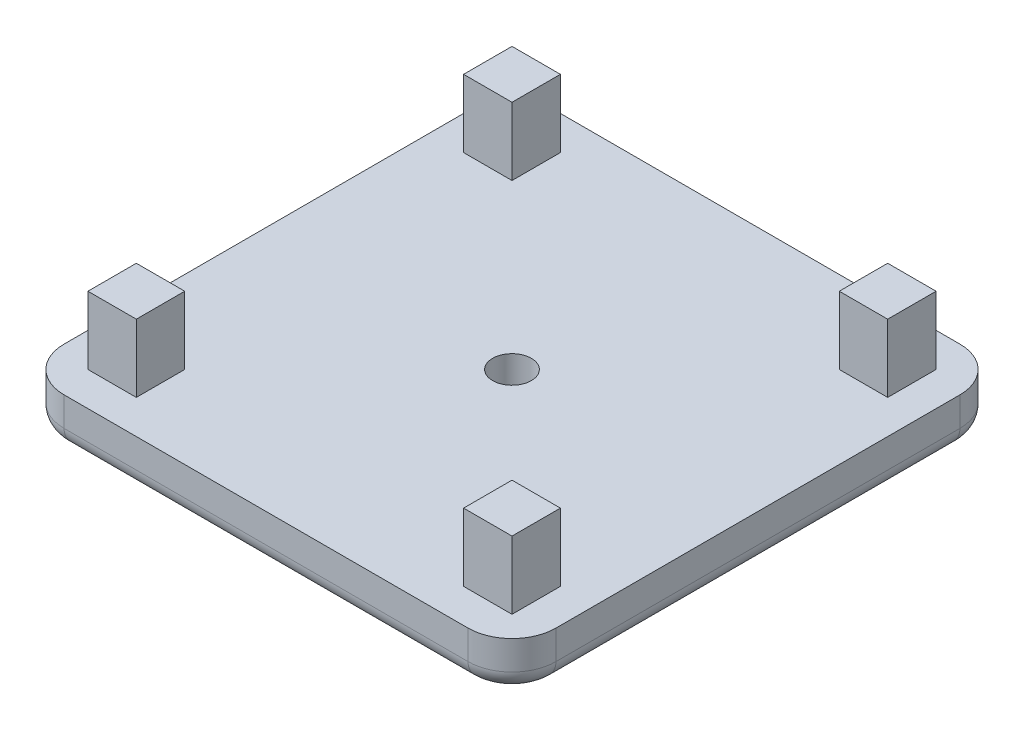
ISO-10303-21;
HEADER;
FILE_DESCRIPTION(('STEP AP214'),'2;1');
FILE_NAME('part.step','',(''),(''),'','','');
FILE_SCHEMA(('AUTOMOTIVE_DESIGN { 1 0 10303 214 1 1 1 1 }'));
ENDSEC;
DATA;
#1=APPLICATION_CONTEXT('core data for automotive mechanical design processes');
#2=APPLICATION_PROTOCOL_DEFINITION('international standard','automotive_design',2000,#1);
#3=PRODUCT_CONTEXT('',#1,'mechanical');
#4=PRODUCT('Part','Part','',(#3));
#5=PRODUCT_RELATED_PRODUCT_CATEGORY('part','',(#4));
#6=PRODUCT_DEFINITION_FORMATION('','',#4);
#7=PRODUCT_DEFINITION_CONTEXT('part definition',#1,'design');
#8=PRODUCT_DEFINITION('design','',#6,#7);
#9=PRODUCT_DEFINITION_SHAPE('','',#8);
#10=(LENGTH_UNIT() NAMED_UNIT(*) SI_UNIT(.MILLI.,.METRE.));
#11=(NAMED_UNIT(*) PLANE_ANGLE_UNIT() SI_UNIT($,.RADIAN.));
#12=(NAMED_UNIT(*) SI_UNIT($,.STERADIAN.) SOLID_ANGLE_UNIT());
#13=UNCERTAINTY_MEASURE_WITH_UNIT(LENGTH_MEASURE(1.E-05),#10,'distance_accuracy_value','');
#14=(GEOMETRIC_REPRESENTATION_CONTEXT(3) GLOBAL_UNCERTAINTY_ASSIGNED_CONTEXT((#13)) GLOBAL_UNIT_ASSIGNED_CONTEXT((#10,
#11,#12)) REPRESENTATION_CONTEXT('',''));
#15=CARTESIAN_POINT('',(0.,0.,0.));
#16=DIRECTION('',(0.,0.,1.));
#17=DIRECTION('',(1.,0.,0.));
#18=AXIS2_PLACEMENT_3D('',#15,#16,#17);
#19=CARTESIAN_POINT('',(0.,0.,0.));
#20=DIRECTION('',(0.,1.,0.));
#21=DIRECTION('',(0.,0.,1.));
#22=AXIS2_PLACEMENT_3D('',#19,#20,#21);
#23=PLANE('',#22);
#24=CARTESIAN_POINT('',(0.,0.,0.));
#25=DIRECTION('',(0.,1.,0.));
#26=DIRECTION('',(0.,0.,1.));
#27=AXIS2_PLACEMENT_3D('',#24,#25,#26);
#28=CIRCLE('',#27,2.);
#29=CARTESIAN_POINT('',(0.,0.,2.));
#30=VERTEX_POINT('',#29);
#31=EDGE_CURVE('E364',#30,#30,#28,.T.);
#32=ORIENTED_EDGE('',*,*,#31,.T.);
#33=EDGE_LOOP('',(#32));
#34=FACE_BOUND('',#33,.T.);
#35=CARTESIAN_POINT('',(20.86,0.,-20.86));
#36=DIRECTION('',(0.,1.,0.));
#37=DIRECTION('',(0.,0.,1.));
#38=AXIS2_PLACEMENT_3D('',#35,#36,#37);
#39=CIRCLE('',#38,2.54);
#40=CARTESIAN_POINT('',(23.4,0.,-20.86));
#41=VERTEX_POINT('',#40);
#42=CARTESIAN_POINT('',(20.86,0.,-23.4));
#43=VERTEX_POINT('',#42);
#44=EDGE_CURVE('E410',#41,#43,#39,.T.);
#45=ORIENTED_EDGE('',*,*,#44,.F.);
#46=DIRECTION('',(0.,0.,-1.));
#47=VECTOR('',#46,1.);
#48=CARTESIAN_POINT('',(23.4,0.,0.));
#49=LINE('',#48,#47);
#50=CARTESIAN_POINT('',(23.4,0.,20.86));
#51=VERTEX_POINT('',#50);
#52=EDGE_CURVE('E383',#41,#51,#49,.F.);
#53=ORIENTED_EDGE('',*,*,#52,.T.);
#54=CARTESIAN_POINT('',(20.86,0.,20.86));
#55=DIRECTION('',(0.,1.,0.));
#56=DIRECTION('',(0.,0.,1.));
#57=AXIS2_PLACEMENT_3D('',#54,#55,#56);
#58=CIRCLE('',#57,2.54);
#59=CARTESIAN_POINT('',(20.86,0.,23.4));
#60=VERTEX_POINT('',#59);
#61=EDGE_CURVE('E408',#60,#51,#58,.T.);
#62=ORIENTED_EDGE('',*,*,#61,.F.);
#63=DIRECTION('',(1.,0.,0.));
#64=VECTOR('',#63,1.);
#65=CARTESIAN_POINT('',(0.,0.,23.4));
#66=LINE('',#65,#64);
#67=CARTESIAN_POINT('',(-20.86,0.,23.4));
#68=VERTEX_POINT('',#67);
#69=EDGE_CURVE('E386',#60,#68,#66,.F.);
#70=ORIENTED_EDGE('',*,*,#69,.T.);
#71=CARTESIAN_POINT('',(-20.86,0.,20.86));
#72=DIRECTION('',(0.,1.,0.));
#73=DIRECTION('',(0.,0.,1.));
#74=AXIS2_PLACEMENT_3D('',#71,#72,#73);
#75=CIRCLE('',#74,2.54);
#76=CARTESIAN_POINT('',(-23.4,0.,20.86));
#77=VERTEX_POINT('',#76);
#78=EDGE_CURVE('E403',#77,#68,#75,.T.);
#79=ORIENTED_EDGE('',*,*,#78,.F.);
#80=DIRECTION('',(0.,0.,1.));
#81=VECTOR('',#80,1.);
#82=CARTESIAN_POINT('',(-23.4,0.,0.));
#83=LINE('',#82,#81);
#84=CARTESIAN_POINT('',(-23.4,0.,-20.86));
#85=VERTEX_POINT('',#84);
#86=EDGE_CURVE('E392',#77,#85,#83,.F.);
#87=ORIENTED_EDGE('',*,*,#86,.T.);
#88=CARTESIAN_POINT('',(-20.86,0.,-20.86));
#89=DIRECTION('',(0.,1.,0.));
#90=DIRECTION('',(0.,0.,1.));
#91=AXIS2_PLACEMENT_3D('',#88,#89,#90);
#92=CIRCLE('',#91,2.54);
#93=CARTESIAN_POINT('',(-20.86,0.,-23.4));
#94=VERTEX_POINT('',#93);
#95=EDGE_CURVE('E405',#94,#85,#92,.T.);
#96=ORIENTED_EDGE('',*,*,#95,.F.);
#97=DIRECTION('',(-1.,0.,0.));
#98=VECTOR('',#97,1.);
#99=CARTESIAN_POINT('',(0.,0.,-23.4));
#100=LINE('',#99,#98);
#101=EDGE_CURVE('E389',#94,#43,#100,.F.);
#102=ORIENTED_EDGE('',*,*,#101,.T.);
#103=EDGE_LOOP('',(#45,#53,#62,#70,#79,#87,#96,#102));
#104=FACE_BOUND('',#103,.T.);
#105=ADVANCED_FACE('F35',(#34,#104),#23,.F.);
#106=CARTESIAN_POINT('',(0.,5.,0.));
#107=DIRECTION('',(0.,1.,0.));
#108=DIRECTION('',(0.,0.,1.));
#109=AXIS2_PLACEMENT_3D('',#106,#107,#108);
#110=PLANE('',#109);
#111=DIRECTION('',(0.,0.,1.));
#112=VECTOR('',#111,1.);
#113=CARTESIAN_POINT('',(-25.4,5.,-25.4));
#114=LINE('',#113,#112);
#115=CARTESIAN_POINT('',(-25.4,5.,-20.86));
#116=VERTEX_POINT('',#115);
#117=CARTESIAN_POINT('',(-25.4,5.,20.86));
#118=VERTEX_POINT('',#117);
#119=EDGE_CURVE('E374',#116,#118,#114,.T.);
#120=ORIENTED_EDGE('',*,*,#119,.T.);
#121=CARTESIAN_POINT('',(-20.86,5.,20.86));
#122=DIRECTION('',(0.,1.,0.));
#123=DIRECTION('',(0.,0.,1.));
#124=AXIS2_PLACEMENT_3D('',#121,#122,#123);
#125=CIRCLE('',#124,4.54);
#126=CARTESIAN_POINT('',(-20.86,5.,25.4));
#127=VERTEX_POINT('',#126);
#128=EDGE_CURVE('E444',#118,#127,#125,.T.);
#129=ORIENTED_EDGE('',*,*,#128,.T.);
#130=DIRECTION('',(1.,0.,0.));
#131=VECTOR('',#130,1.);
#132=CARTESIAN_POINT('',(-25.4,5.,25.4));
#133=LINE('',#132,#131);
#134=CARTESIAN_POINT('',(20.86,5.,25.4));
#135=VERTEX_POINT('',#134);
#136=EDGE_CURVE('E377',#127,#135,#133,.T.);
#137=ORIENTED_EDGE('',*,*,#136,.T.);
#138=CARTESIAN_POINT('',(20.86,5.,20.86));
#139=DIRECTION('',(0.,1.,0.));
#140=DIRECTION('',(0.,0.,1.));
#141=AXIS2_PLACEMENT_3D('',#138,#139,#140);
#142=CIRCLE('',#141,4.54);
#143=CARTESIAN_POINT('',(25.4,5.,20.86));
#144=VERTEX_POINT('',#143);
#145=EDGE_CURVE('E440',#135,#144,#142,.T.);
#146=ORIENTED_EDGE('',*,*,#145,.T.);
#147=DIRECTION('',(0.,0.,-1.));
#148=VECTOR('',#147,1.);
#149=CARTESIAN_POINT('',(25.4,5.,-25.4));
#150=LINE('',#149,#148);
#151=CARTESIAN_POINT('',(25.4,5.,-20.86));
#152=VERTEX_POINT('',#151);
#153=EDGE_CURVE('E368',#144,#152,#150,.T.);
#154=ORIENTED_EDGE('',*,*,#153,.T.);
#155=CARTESIAN_POINT('',(20.86,5.,-20.86));
#156=DIRECTION('',(0.,1.,0.));
#157=DIRECTION('',(0.,0.,1.));
#158=AXIS2_PLACEMENT_3D('',#155,#156,#157);
#159=CIRCLE('',#158,4.54);
#160=CARTESIAN_POINT('',(20.86,5.,-25.4));
#161=VERTEX_POINT('',#160);
#162=EDGE_CURVE('E59',#152,#161,#159,.T.);
#163=ORIENTED_EDGE('',*,*,#162,.T.);
#164=DIRECTION('',(-1.,0.,0.));
#165=VECTOR('',#164,1.);
#166=CARTESIAN_POINT('',(-25.4,5.,-25.4));
#167=LINE('',#166,#165);
#168=CARTESIAN_POINT('',(-20.86,5.,-25.4));
#169=VERTEX_POINT('',#168);
#170=EDGE_CURVE('E372',#161,#169,#167,.T.);
#171=ORIENTED_EDGE('',*,*,#170,.T.);
#172=CARTESIAN_POINT('',(-20.86,5.,-20.86));
#173=DIRECTION('',(0.,1.,0.));
#174=DIRECTION('',(0.,0.,1.));
#175=AXIS2_PLACEMENT_3D('',#172,#173,#174);
#176=CIRCLE('',#175,4.54);
#177=EDGE_CURVE('E442',#169,#116,#176,.T.);
#178=ORIENTED_EDGE('',*,*,#177,.T.);
#179=EDGE_LOOP('',(#120,#129,#137,#146,#154,#163,#171,#178));
#180=FACE_BOUND('',#179,.T.);
#181=CARTESIAN_POINT('',(0.,5.,0.));
#182=DIRECTION('',(0.,1.,0.));
#183=DIRECTION('',(0.,0.,1.));
#184=AXIS2_PLACEMENT_3D('',#181,#182,#183);
#185=CIRCLE('',#184,2.);
#186=CARTESIAN_POINT('',(0.,5.,2.));
#187=VERTEX_POINT('',#186);
#188=EDGE_CURVE('E365',#187,#187,#185,.T.);
#189=ORIENTED_EDGE('',*,*,#188,.F.);
#190=EDGE_LOOP('',(#189));
#191=FACE_BOUND('',#190,.T.);
#192=DIRECTION('',(1.,0.,0.));
#193=VECTOR('',#192,1.);
#194=CARTESIAN_POINT('',(-16.9,5.,-16.9));
#195=LINE('',#194,#193);
#196=CARTESIAN_POINT('',(-21.9,5.,-16.9));
#197=VERTEX_POINT('',#196);
#198=CARTESIAN_POINT('',(-16.9,5.,-16.9));
#199=VERTEX_POINT('',#198);
#200=EDGE_CURVE('E230',#197,#199,#195,.T.);
#201=ORIENTED_EDGE('',*,*,#200,.F.);
#202=DIRECTION('',(0.,0.,1.));
#203=VECTOR('',#202,1.);
#204=CARTESIAN_POINT('',(-21.9,5.,-16.9));
#205=LINE('',#204,#203);
#206=CARTESIAN_POINT('',(-21.9,5.,-21.9));
#207=VERTEX_POINT('',#206);
#208=EDGE_CURVE('E355',#207,#197,#205,.T.);
#209=ORIENTED_EDGE('',*,*,#208,.F.);
#210=DIRECTION('',(-1.,0.,0.));
#211=VECTOR('',#210,1.);
#212=CARTESIAN_POINT('',(-16.9,5.,-21.9));
#213=LINE('',#212,#211);
#214=CARTESIAN_POINT('',(-16.9,5.,-21.9));
#215=VERTEX_POINT('',#214);
#216=EDGE_CURVE('E361',#215,#207,#213,.T.);
#217=ORIENTED_EDGE('',*,*,#216,.F.);
#218=DIRECTION('',(0.,0.,-1.));
#219=VECTOR('',#218,1.);
#220=CARTESIAN_POINT('',(-16.9,5.,-16.9));
#221=LINE('',#220,#219);
#222=EDGE_CURVE('E359',#199,#215,#221,.T.);
#223=ORIENTED_EDGE('',*,*,#222,.F.);
#224=EDGE_LOOP('',(#201,#209,#217,#223));
#225=FACE_BOUND('',#224,.T.);
#226=DIRECTION('',(1.,0.,0.));
#227=VECTOR('',#226,1.);
#228=CARTESIAN_POINT('',(16.9,5.,-16.9));
#229=LINE('',#228,#227);
#230=CARTESIAN_POINT('',(16.9,5.,-16.9));
#231=VERTEX_POINT('',#230);
#232=CARTESIAN_POINT('',(21.9,5.,-16.9));
#233=VERTEX_POINT('',#232);
#234=EDGE_CURVE('E346',#231,#233,#229,.T.);
#235=ORIENTED_EDGE('',*,*,#234,.F.);
#236=DIRECTION('',(0.,0.,1.));
#237=VECTOR('',#236,1.);
#238=CARTESIAN_POINT('',(16.9,5.,-16.9));
#239=LINE('',#238,#237);
#240=CARTESIAN_POINT('',(16.9,5.,-21.9));
#241=VERTEX_POINT('',#240);
#242=EDGE_CURVE('E343',#241,#231,#239,.T.);
#243=ORIENTED_EDGE('',*,*,#242,.F.);
#244=DIRECTION('',(-1.,0.,0.));
#245=VECTOR('',#244,1.);
#246=CARTESIAN_POINT('',(16.9,5.,-21.9));
#247=LINE('',#246,#245);
#248=CARTESIAN_POINT('',(21.9,5.,-21.9));
#249=VERTEX_POINT('',#248);
#250=EDGE_CURVE('E352',#249,#241,#247,.T.);
#251=ORIENTED_EDGE('',*,*,#250,.F.);
#252=DIRECTION('',(0.,0.,-1.));
#253=VECTOR('',#252,1.);
#254=CARTESIAN_POINT('',(21.9,5.,-16.9));
#255=LINE('',#254,#253);
#256=EDGE_CURVE('E349',#233,#249,#255,.T.);
#257=ORIENTED_EDGE('',*,*,#256,.F.);
#258=EDGE_LOOP('',(#235,#243,#251,#257));
#259=FACE_BOUND('',#258,.T.);
#260=DIRECTION('',(0.,0.,1.));
#261=VECTOR('',#260,1.);
#262=CARTESIAN_POINT('',(-21.9,5.,16.9));
#263=LINE('',#262,#261);
#264=CARTESIAN_POINT('',(-21.9,5.,16.9));
#265=VERTEX_POINT('',#264);
#266=CARTESIAN_POINT('',(-21.9,5.,21.9));
#267=VERTEX_POINT('',#266);
#268=EDGE_CURVE('E334',#265,#267,#263,.T.);
#269=ORIENTED_EDGE('',*,*,#268,.F.);
#270=DIRECTION('',(-1.,0.,0.));
#271=VECTOR('',#270,1.);
#272=CARTESIAN_POINT('',(-16.9,5.,16.9));
#273=LINE('',#272,#271);
#274=CARTESIAN_POINT('',(-16.9,5.,16.9));
#275=VERTEX_POINT('',#274);
#276=EDGE_CURVE('E331',#275,#265,#273,.T.);
#277=ORIENTED_EDGE('',*,*,#276,.F.);
#278=DIRECTION('',(0.,0.,-1.));
#279=VECTOR('',#278,1.);
#280=CARTESIAN_POINT('',(-16.9,5.,16.9));
#281=LINE('',#280,#279);
#282=CARTESIAN_POINT('',(-16.9,5.,21.9));
#283=VERTEX_POINT('',#282);
#284=EDGE_CURVE('E340',#283,#275,#281,.T.);
#285=ORIENTED_EDGE('',*,*,#284,.F.);
#286=DIRECTION('',(1.,0.,0.));
#287=VECTOR('',#286,1.);
#288=CARTESIAN_POINT('',(-16.9,5.,21.9));
#289=LINE('',#288,#287);
#290=EDGE_CURVE('E337',#267,#283,#289,.T.);
#291=ORIENTED_EDGE('',*,*,#290,.F.);
#292=EDGE_LOOP('',(#269,#277,#285,#291));
#293=FACE_BOUND('',#292,.T.);
#294=DIRECTION('',(1.,0.,0.));
#295=VECTOR('',#294,1.);
#296=CARTESIAN_POINT('',(16.9,5.,21.9));
#297=LINE('',#296,#295);
#298=CARTESIAN_POINT('',(16.9,5.,21.9));
#299=VERTEX_POINT('',#298);
#300=CARTESIAN_POINT('',(21.9,5.,21.9));
#301=VERTEX_POINT('',#300);
#302=EDGE_CURVE('E321',#299,#301,#297,.T.);
#303=ORIENTED_EDGE('',*,*,#302,.F.);
#304=DIRECTION('',(0.,0.,1.));
#305=VECTOR('',#304,1.);
#306=CARTESIAN_POINT('',(16.9,5.,16.9));
#307=LINE('',#306,#305);
#308=CARTESIAN_POINT('',(16.9,5.,16.9));
#309=VERTEX_POINT('',#308);
#310=EDGE_CURVE('E318',#309,#299,#307,.T.);
#311=ORIENTED_EDGE('',*,*,#310,.F.);
#312=DIRECTION('',(-1.,0.,0.));
#313=VECTOR('',#312,1.);
#314=CARTESIAN_POINT('',(16.9,5.,16.9));
#315=LINE('',#314,#313);
#316=CARTESIAN_POINT('',(21.9,5.,16.9));
#317=VERTEX_POINT('',#316);
#318=EDGE_CURVE('E328',#317,#309,#315,.T.);
#319=ORIENTED_EDGE('',*,*,#318,.F.);
#320=DIRECTION('',(0.,0.,-1.));
#321=VECTOR('',#320,1.);
#322=CARTESIAN_POINT('',(21.9,5.,16.9));
#323=LINE('',#322,#321);
#324=EDGE_CURVE('E325',#301,#317,#323,.T.);
#325=ORIENTED_EDGE('',*,*,#324,.F.);
#326=EDGE_LOOP('',(#303,#311,#319,#325));
#327=FACE_BOUND('',#326,.T.);
#328=ADVANCED_FACE('F474',(#180,#191,#225,#259,#293,#327),#110,.T.);
#329=CARTESIAN_POINT('',(25.4,5.,-25.4));
#330=DIRECTION('',(-1.,0.,0.));
#331=DIRECTION('',(0.,0.,1.));
#332=AXIS2_PLACEMENT_3D('',#329,#330,#331);
#333=PLANE('',#332);
#334=ORIENTED_EDGE('',*,*,#153,.F.);
#335=DIRECTION('',(0.,-1.,0.));
#336=VECTOR('',#335,1.);
#337=CARTESIAN_POINT('',(25.4,5.,20.86));
#338=LINE('',#337,#336);
#339=CARTESIAN_POINT('',(25.4,2.,20.86));
#340=VERTEX_POINT('',#339);
#341=EDGE_CURVE('E11',#144,#340,#338,.T.);
#342=ORIENTED_EDGE('',*,*,#341,.T.);
#343=DIRECTION('',(0.,0.,-1.));
#344=VECTOR('',#343,1.);
#345=CARTESIAN_POINT('',(25.4,2.,-25.4));
#346=LINE('',#345,#344);
#347=CARTESIAN_POINT('',(25.4,2.,-20.86));
#348=VERTEX_POINT('',#347);
#349=EDGE_CURVE('E400',#340,#348,#346,.T.);
#350=ORIENTED_EDGE('',*,*,#349,.T.);
#351=DIRECTION('',(0.,-1.,0.));
#352=VECTOR('',#351,1.);
#353=CARTESIAN_POINT('',(25.4,5.,-20.86));
#354=LINE('',#353,#352);
#355=EDGE_CURVE('E44',#348,#152,#354,.F.);
#356=ORIENTED_EDGE('',*,*,#355,.T.);
#357=EDGE_LOOP('',(#334,#342,#350,#356));
#358=FACE_BOUND('',#357,.T.);
#359=ADVANCED_FACE('F522',(#358),#333,.F.);
#360=CARTESIAN_POINT('',(-25.4,5.,-25.4));
#361=DIRECTION('',(0.,0.,1.));
#362=DIRECTION('',(1.,0.,0.));
#363=AXIS2_PLACEMENT_3D('',#360,#361,#362);
#364=PLANE('',#363);
#365=DIRECTION('',(-1.,0.,0.));
#366=VECTOR('',#365,1.);
#367=CARTESIAN_POINT('',(-25.4,2.,-25.4));
#368=LINE('',#367,#366);
#369=CARTESIAN_POINT('',(20.86,2.,-25.4));
#370=VERTEX_POINT('',#369);
#371=CARTESIAN_POINT('',(-20.86,2.,-25.4));
#372=VERTEX_POINT('',#371);
#373=EDGE_CURVE('E395',#370,#372,#368,.T.);
#374=ORIENTED_EDGE('',*,*,#373,.T.);
#375=DIRECTION('',(0.,-1.,0.));
#376=VECTOR('',#375,1.);
#377=CARTESIAN_POINT('',(-20.86,5.,-25.4));
#378=LINE('',#377,#376);
#379=EDGE_CURVE('E52',#372,#169,#378,.F.);
#380=ORIENTED_EDGE('',*,*,#379,.T.);
#381=ORIENTED_EDGE('',*,*,#170,.F.);
#382=DIRECTION('',(0.,-1.,0.));
#383=VECTOR('',#382,1.);
#384=CARTESIAN_POINT('',(20.86,5.,-25.4));
#385=LINE('',#384,#383);
#386=EDGE_CURVE('E446',#161,#370,#385,.T.);
#387=ORIENTED_EDGE('',*,*,#386,.T.);
#388=EDGE_LOOP('',(#374,#380,#381,#387));
#389=FACE_BOUND('',#388,.T.);
#390=ADVANCED_FACE('F492',(#389),#364,.F.);
#391=CARTESIAN_POINT('',(-25.4,5.,-25.4));
#392=DIRECTION('',(1.,0.,0.));
#393=DIRECTION('',(0.,0.,-1.));
#394=AXIS2_PLACEMENT_3D('',#391,#392,#393);
#395=PLANE('',#394);
#396=DIRECTION('',(0.,0.,1.));
#397=VECTOR('',#396,1.);
#398=CARTESIAN_POINT('',(-25.4,2.,-25.4));
#399=LINE('',#398,#397);
#400=CARTESIAN_POINT('',(-25.4,2.,-20.86));
#401=VERTEX_POINT('',#400);
#402=CARTESIAN_POINT('',(-25.4,2.,20.86));
#403=VERTEX_POINT('',#402);
#404=EDGE_CURVE('E380',#401,#403,#399,.T.);
#405=ORIENTED_EDGE('',*,*,#404,.T.);
#406=DIRECTION('',(0.,-1.,0.));
#407=VECTOR('',#406,1.);
#408=CARTESIAN_POINT('',(-25.4,5.,20.86));
#409=LINE('',#408,#407);
#410=EDGE_CURVE('E437',#403,#118,#409,.F.);
#411=ORIENTED_EDGE('',*,*,#410,.T.);
#412=ORIENTED_EDGE('',*,*,#119,.F.);
#413=DIRECTION('',(0.,-1.,0.));
#414=VECTOR('',#413,1.);
#415=CARTESIAN_POINT('',(-25.4,5.,-20.86));
#416=LINE('',#415,#414);
#417=EDGE_CURVE('E435',#116,#401,#416,.T.);
#418=ORIENTED_EDGE('',*,*,#417,.T.);
#419=EDGE_LOOP('',(#405,#411,#412,#418));
#420=FACE_BOUND('',#419,.T.);
#421=ADVANCED_FACE('F471',(#420),#395,.F.);
#422=CARTESIAN_POINT('',(-25.4,5.,25.4));
#423=DIRECTION('',(0.,0.,-1.));
#424=DIRECTION('',(-1.,0.,0.));
#425=AXIS2_PLACEMENT_3D('',#422,#423,#424);
#426=PLANE('',#425);
#427=ORIENTED_EDGE('',*,*,#136,.F.);
#428=DIRECTION('',(0.,-1.,0.));
#429=VECTOR('',#428,1.);
#430=CARTESIAN_POINT('',(-20.86,5.,25.4));
#431=LINE('',#430,#429);
#432=CARTESIAN_POINT('',(-20.86,2.,25.4));
#433=VERTEX_POINT('',#432);
#434=EDGE_CURVE('E433',#127,#433,#431,.T.);
#435=ORIENTED_EDGE('',*,*,#434,.T.);
#436=DIRECTION('',(1.,0.,0.));
#437=VECTOR('',#436,1.);
#438=CARTESIAN_POINT('',(-25.4,2.,25.4));
#439=LINE('',#438,#437);
#440=CARTESIAN_POINT('',(20.86,2.,25.4));
#441=VERTEX_POINT('',#440);
#442=EDGE_CURVE('E397',#433,#441,#439,.T.);
#443=ORIENTED_EDGE('',*,*,#442,.T.);
#444=DIRECTION('',(0.,-1.,0.));
#445=VECTOR('',#444,1.);
#446=CARTESIAN_POINT('',(20.86,5.,25.4));
#447=LINE('',#446,#445);
#448=EDGE_CURVE('E431',#441,#135,#447,.F.);
#449=ORIENTED_EDGE('',*,*,#448,.T.);
#450=EDGE_LOOP('',(#427,#435,#443,#449));
#451=FACE_BOUND('',#450,.T.);
#452=ADVANCED_FACE('F515',(#451),#426,.F.);
#453=CARTESIAN_POINT('',(0.,5.,0.));
#454=DIRECTION('',(0.,-1.,0.));
#455=DIRECTION('',(0.,0.,-1.));
#456=AXIS2_PLACEMENT_3D('',#453,#454,#455);
#457=CYLINDRICAL_SURFACE('',#456,2.);
#458=ORIENTED_EDGE('',*,*,#188,.T.);
#459=EDGE_LOOP('',(#458));
#460=FACE_BOUND('',#459,.T.);
#461=ORIENTED_EDGE('',*,*,#31,.F.);
#462=EDGE_LOOP('',(#461));
#463=FACE_BOUND('',#462,.T.);
#464=ADVANCED_FACE('F541',(#460,#463),#457,.F.);
#465=CARTESIAN_POINT('',(23.4,2.,-25.4));
#466=DIRECTION('',(0.,0.,-1.));
#467=DIRECTION('',(-1.,0.,0.));
#468=AXIS2_PLACEMENT_3D('',#465,#466,#467);
#469=CYLINDRICAL_SURFACE('',#468,2.);
#470=ORIENTED_EDGE('',*,*,#349,.F.);
#471=CARTESIAN_POINT('',(23.4,2.,20.86));
#472=DIRECTION('',(0.,0.,-1.));
#473=DIRECTION('',(-1.,0.,0.));
#474=AXIS2_PLACEMENT_3D('',#471,#472,#473);
#475=CIRCLE('',#474,2.);
#476=EDGE_CURVE('E419',#340,#51,#475,.T.);
#477=ORIENTED_EDGE('',*,*,#476,.T.);
#478=ORIENTED_EDGE('',*,*,#52,.F.);
#479=CARTESIAN_POINT('',(23.4,2.,-20.86));
#480=DIRECTION('',(0.,0.,1.));
#481=DIRECTION('',(1.,0.,0.));
#482=AXIS2_PLACEMENT_3D('',#479,#480,#481);
#483=CIRCLE('',#482,2.);
#484=EDGE_CURVE('E417',#41,#348,#483,.T.);
#485=ORIENTED_EDGE('',*,*,#484,.T.);
#486=EDGE_LOOP('',(#470,#477,#478,#485));
#487=FACE_BOUND('',#486,.T.);
#488=ADVANCED_FACE('F503',(#487),#469,.T.);
#489=CARTESIAN_POINT('',(-25.4,2.,-23.4));
#490=DIRECTION('',(-1.,0.,0.));
#491=DIRECTION('',(0.,0.,1.));
#492=AXIS2_PLACEMENT_3D('',#489,#490,#491);
#493=CYLINDRICAL_SURFACE('',#492,2.);
#494=ORIENTED_EDGE('',*,*,#373,.F.);
#495=CARTESIAN_POINT('',(20.86,2.,-23.4));
#496=DIRECTION('',(-1.,0.,0.));
#497=DIRECTION('',(0.,0.,1.));
#498=AXIS2_PLACEMENT_3D('',#495,#496,#497);
#499=CIRCLE('',#498,2.);
#500=EDGE_CURVE('E415',#370,#43,#499,.T.);
#501=ORIENTED_EDGE('',*,*,#500,.T.);
#502=ORIENTED_EDGE('',*,*,#101,.F.);
#503=CARTESIAN_POINT('',(-20.86,2.,-23.4));
#504=DIRECTION('',(1.,0.,0.));
#505=DIRECTION('',(0.,0.,-1.));
#506=AXIS2_PLACEMENT_3D('',#503,#504,#505);
#507=CIRCLE('',#506,2.);
#508=EDGE_CURVE('E413',#94,#372,#507,.T.);
#509=ORIENTED_EDGE('',*,*,#508,.T.);
#510=EDGE_LOOP('',(#494,#501,#502,#509));
#511=FACE_BOUND('',#510,.T.);
#512=ADVANCED_FACE('F490',(#511),#493,.T.);
#513=CARTESIAN_POINT('',(-25.4,2.,23.4));
#514=DIRECTION('',(1.,0.,0.));
#515=DIRECTION('',(0.,0.,-1.));
#516=AXIS2_PLACEMENT_3D('',#513,#514,#515);
#517=CYLINDRICAL_SURFACE('',#516,2.);
#518=ORIENTED_EDGE('',*,*,#442,.F.);
#519=CARTESIAN_POINT('',(-20.86,2.,23.4));
#520=DIRECTION('',(1.,0.,0.));
#521=DIRECTION('',(0.,0.,-1.));
#522=AXIS2_PLACEMENT_3D('',#519,#520,#521);
#523=CIRCLE('',#522,2.);
#524=EDGE_CURVE('E428',#433,#68,#523,.T.);
#525=ORIENTED_EDGE('',*,*,#524,.T.);
#526=ORIENTED_EDGE('',*,*,#69,.F.);
#527=CARTESIAN_POINT('',(20.86,2.,23.4));
#528=DIRECTION('',(-1.,0.,0.));
#529=DIRECTION('',(0.,0.,1.));
#530=AXIS2_PLACEMENT_3D('',#527,#528,#529);
#531=CIRCLE('',#530,2.);
#532=EDGE_CURVE('E426',#60,#441,#531,.T.);
#533=ORIENTED_EDGE('',*,*,#532,.T.);
#534=EDGE_LOOP('',(#518,#525,#526,#533));
#535=FACE_BOUND('',#534,.T.);
#536=ADVANCED_FACE('F512',(#535),#517,.T.);
#537=CARTESIAN_POINT('',(-23.4,2.,-25.4));
#538=DIRECTION('',(0.,0.,1.));
#539=DIRECTION('',(1.,0.,0.));
#540=AXIS2_PLACEMENT_3D('',#537,#538,#539);
#541=CYLINDRICAL_SURFACE('',#540,2.);
#542=ORIENTED_EDGE('',*,*,#404,.F.);
#543=CARTESIAN_POINT('',(-23.4,2.,-20.86));
#544=DIRECTION('',(0.,0.,1.));
#545=DIRECTION('',(1.,0.,0.));
#546=AXIS2_PLACEMENT_3D('',#543,#544,#545);
#547=CIRCLE('',#546,2.);
#548=EDGE_CURVE('E424',#401,#85,#547,.T.);
#549=ORIENTED_EDGE('',*,*,#548,.T.);
#550=ORIENTED_EDGE('',*,*,#86,.F.);
#551=CARTESIAN_POINT('',(-23.4,2.,20.86));
#552=DIRECTION('',(0.,0.,-1.));
#553=DIRECTION('',(-1.,0.,0.));
#554=AXIS2_PLACEMENT_3D('',#551,#552,#553);
#555=CIRCLE('',#554,2.);
#556=EDGE_CURVE('E422',#77,#403,#555,.T.);
#557=ORIENTED_EDGE('',*,*,#556,.T.);
#558=EDGE_LOOP('',(#542,#549,#550,#557));
#559=FACE_BOUND('',#558,.T.);
#560=ADVANCED_FACE('F481',(#559),#541,.T.);
#561=CARTESIAN_POINT('',(20.86,5.,-20.86));
#562=DIRECTION('',(0.,-1.,0.));
#563=DIRECTION('',(0.,0.,-1.));
#564=AXIS2_PLACEMENT_3D('',#561,#562,#563);
#565=CYLINDRICAL_SURFACE('',#564,4.54);
#566=ORIENTED_EDGE('',*,*,#162,.F.);
#567=ORIENTED_EDGE('',*,*,#355,.F.);
#568=CARTESIAN_POINT('',(20.86,2.,-20.86));
#569=DIRECTION('',(0.,1.,0.));
#570=DIRECTION('',(0.,0.,1.));
#571=AXIS2_PLACEMENT_3D('',#568,#569,#570);
#572=CIRCLE('',#571,4.54);
#573=EDGE_CURVE('E322',#370,#348,#572,.F.);
#574=ORIENTED_EDGE('',*,*,#573,.F.);
#575=ORIENTED_EDGE('',*,*,#386,.F.);
#576=EDGE_LOOP('',(#566,#567,#574,#575));
#577=FACE_BOUND('',#576,.T.);
#578=ADVANCED_FACE('F495',(#577),#565,.T.);
#579=CARTESIAN_POINT('',(20.86,2.,-20.86));
#580=DIRECTION('',(0.,1.,0.));
#581=DIRECTION('',(0.,0.,1.));
#582=AXIS2_PLACEMENT_3D('',#579,#580,#581);
#583=TOROIDAL_SURFACE('',#582,2.54,2.);
#584=ORIENTED_EDGE('',*,*,#484,.F.);
#585=ORIENTED_EDGE('',*,*,#44,.T.);
#586=ORIENTED_EDGE('',*,*,#500,.F.);
#587=ORIENTED_EDGE('',*,*,#573,.T.);
#588=EDGE_LOOP('',(#584,#585,#586,#587));
#589=FACE_BOUND('',#588,.T.);
#590=ADVANCED_FACE('F499',(#589),#583,.T.);
#591=CARTESIAN_POINT('',(20.86,5.,20.86));
#592=DIRECTION('',(0.,-1.,0.));
#593=DIRECTION('',(0.,0.,-1.));
#594=AXIS2_PLACEMENT_3D('',#591,#592,#593);
#595=CYLINDRICAL_SURFACE('',#594,4.54);
#596=ORIENTED_EDGE('',*,*,#145,.F.);
#597=ORIENTED_EDGE('',*,*,#448,.F.);
#598=CARTESIAN_POINT('',(20.86,2.,20.86));
#599=DIRECTION('',(0.,1.,0.));
#600=DIRECTION('',(0.,0.,1.));
#601=AXIS2_PLACEMENT_3D('',#598,#599,#600);
#602=CIRCLE('',#601,4.54);
#603=EDGE_CURVE('E452',#340,#441,#602,.F.);
#604=ORIENTED_EDGE('',*,*,#603,.F.);
#605=ORIENTED_EDGE('',*,*,#341,.F.);
#606=EDGE_LOOP('',(#596,#597,#604,#605));
#607=FACE_BOUND('',#606,.T.);
#608=ADVANCED_FACE('F518',(#607),#595,.T.);
#609=CARTESIAN_POINT('',(20.86,2.,20.86));
#610=DIRECTION('',(0.,1.,0.));
#611=DIRECTION('',(0.,0.,1.));
#612=AXIS2_PLACEMENT_3D('',#609,#610,#611);
#613=TOROIDAL_SURFACE('',#612,2.54,2.);
#614=ORIENTED_EDGE('',*,*,#476,.F.);
#615=ORIENTED_EDGE('',*,*,#603,.T.);
#616=ORIENTED_EDGE('',*,*,#532,.F.);
#617=ORIENTED_EDGE('',*,*,#61,.T.);
#618=EDGE_LOOP('',(#614,#615,#616,#617));
#619=FACE_BOUND('',#618,.T.);
#620=ADVANCED_FACE('F507',(#619),#613,.T.);
#621=CARTESIAN_POINT('',(-20.86,5.,-20.86));
#622=DIRECTION('',(0.,-1.,0.));
#623=DIRECTION('',(0.,0.,-1.));
#624=AXIS2_PLACEMENT_3D('',#621,#622,#623);
#625=CYLINDRICAL_SURFACE('',#624,4.54);
#626=ORIENTED_EDGE('',*,*,#177,.F.);
#627=ORIENTED_EDGE('',*,*,#379,.F.);
#628=CARTESIAN_POINT('',(-20.86,2.,-20.86));
#629=DIRECTION('',(0.,1.,0.));
#630=DIRECTION('',(0.,0.,1.));
#631=AXIS2_PLACEMENT_3D('',#628,#629,#630);
#632=CIRCLE('',#631,4.54);
#633=EDGE_CURVE('E454',#401,#372,#632,.F.);
#634=ORIENTED_EDGE('',*,*,#633,.F.);
#635=ORIENTED_EDGE('',*,*,#417,.F.);
#636=EDGE_LOOP('',(#626,#627,#634,#635));
#637=FACE_BOUND('',#636,.T.);
#638=ADVANCED_FACE('F479',(#637),#625,.T.);
#639=CARTESIAN_POINT('',(-20.86,2.,-20.86));
#640=DIRECTION('',(0.,1.,0.));
#641=DIRECTION('',(0.,0.,1.));
#642=AXIS2_PLACEMENT_3D('',#639,#640,#641);
#643=TOROIDAL_SURFACE('',#642,2.54,2.);
#644=ORIENTED_EDGE('',*,*,#508,.F.);
#645=ORIENTED_EDGE('',*,*,#95,.T.);
#646=ORIENTED_EDGE('',*,*,#548,.F.);
#647=ORIENTED_EDGE('',*,*,#633,.T.);
#648=EDGE_LOOP('',(#644,#645,#646,#647));
#649=FACE_BOUND('',#648,.T.);
#650=ADVANCED_FACE('F487',(#649),#643,.T.);
#651=CARTESIAN_POINT('',(-20.86,5.,20.86));
#652=DIRECTION('',(0.,-1.,0.));
#653=DIRECTION('',(0.,0.,-1.));
#654=AXIS2_PLACEMENT_3D('',#651,#652,#653);
#655=CYLINDRICAL_SURFACE('',#654,4.54);
#656=ORIENTED_EDGE('',*,*,#128,.F.);
#657=ORIENTED_EDGE('',*,*,#410,.F.);
#658=CARTESIAN_POINT('',(-20.86,2.,20.86));
#659=DIRECTION('',(0.,1.,0.));
#660=DIRECTION('',(0.,0.,1.));
#661=AXIS2_PLACEMENT_3D('',#658,#659,#660);
#662=CIRCLE('',#661,4.54);
#663=EDGE_CURVE('E39',#433,#403,#662,.F.);
#664=ORIENTED_EDGE('',*,*,#663,.F.);
#665=ORIENTED_EDGE('',*,*,#434,.F.);
#666=EDGE_LOOP('',(#656,#657,#664,#665));
#667=FACE_BOUND('',#666,.T.);
#668=ADVANCED_FACE('F37',(#667),#655,.T.);
#669=CARTESIAN_POINT('',(-20.86,2.,20.86));
#670=DIRECTION('',(0.,1.,0.));
#671=DIRECTION('',(0.,0.,1.));
#672=AXIS2_PLACEMENT_3D('',#669,#670,#671);
#673=TOROIDAL_SURFACE('',#672,2.54,2.);
#674=ORIENTED_EDGE('',*,*,#524,.F.);
#675=ORIENTED_EDGE('',*,*,#663,.T.);
#676=ORIENTED_EDGE('',*,*,#556,.F.);
#677=ORIENTED_EDGE('',*,*,#78,.T.);
#678=EDGE_LOOP('',(#674,#675,#676,#677));
#679=FACE_BOUND('',#678,.T.);
#680=ADVANCED_FACE('F464',(#679),#673,.T.);
#681=CARTESIAN_POINT('',(-16.9,12.,0.));
#682=DIRECTION('',(1.,0.,0.));
#683=DIRECTION('',(0.,0.,-1.));
#684=AXIS2_PLACEMENT_3D('',#681,#682,#683);
#685=PLANE('',#684);
#686=DIRECTION('',(0.,-1.,0.));
#687=VECTOR('',#686,1.);
#688=CARTESIAN_POINT('',(-16.9,12.,21.9));
#689=LINE('',#688,#687);
#690=CARTESIAN_POINT('',(-16.9,12.,21.9));
#691=VERTEX_POINT('',#690);
#692=EDGE_CURVE('E306',#691,#283,#689,.T.);
#693=ORIENTED_EDGE('',*,*,#692,.T.);
#694=ORIENTED_EDGE('',*,*,#284,.T.);
#695=DIRECTION('',(0.,-1.,0.));
#696=VECTOR('',#695,1.);
#697=CARTESIAN_POINT('',(-16.9,12.,16.9));
#698=LINE('',#697,#696);
#699=CARTESIAN_POINT('',(-16.9,12.,16.9));
#700=VERTEX_POINT('',#699);
#701=EDGE_CURVE('E315',#700,#275,#698,.T.);
#702=ORIENTED_EDGE('',*,*,#701,.F.);
#703=DIRECTION('',(0.,0.,1.));
#704=VECTOR('',#703,1.);
#705=CARTESIAN_POINT('',(-16.9,12.,0.));
#706=LINE('',#705,#704);
#707=EDGE_CURVE('E296',#700,#691,#706,.T.);
#708=ORIENTED_EDGE('',*,*,#707,.T.);
#709=EDGE_LOOP('',(#693,#694,#702,#708));
#710=FACE_BOUND('',#709,.T.);
#711=ADVANCED_FACE('F627',(#710),#685,.T.);
#712=CARTESIAN_POINT('',(0.,12.,16.9));
#713=DIRECTION('',(0.,0.,1.));
#714=DIRECTION('',(1.,0.,0.));
#715=AXIS2_PLACEMENT_3D('',#712,#713,#714);
#716=PLANE('',#715);
#717=ORIENTED_EDGE('',*,*,#276,.T.);
#718=DIRECTION('',(0.,-1.,0.));
#719=VECTOR('',#718,1.);
#720=CARTESIAN_POINT('',(-21.9,12.,16.9));
#721=LINE('',#720,#719);
#722=CARTESIAN_POINT('',(-21.9,12.,16.9));
#723=VERTEX_POINT('',#722);
#724=EDGE_CURVE('E312',#723,#265,#721,.T.);
#725=ORIENTED_EDGE('',*,*,#724,.F.);
#726=DIRECTION('',(-1.,0.,0.));
#727=VECTOR('',#726,1.);
#728=CARTESIAN_POINT('',(0.,12.,16.9));
#729=LINE('',#728,#727);
#730=EDGE_CURVE('E299',#700,#723,#729,.T.);
#731=ORIENTED_EDGE('',*,*,#730,.F.);
#732=ORIENTED_EDGE('',*,*,#701,.T.);
#733=EDGE_LOOP('',(#717,#725,#731,#732));
#734=FACE_BOUND('',#733,.T.);
#735=ADVANCED_FACE('F633',(#734),#716,.F.);
#736=CARTESIAN_POINT('',(-21.9,12.,0.));
#737=DIRECTION('',(1.,0.,0.));
#738=DIRECTION('',(0.,0.,-1.));
#739=AXIS2_PLACEMENT_3D('',#736,#737,#738);
#740=PLANE('',#739);
#741=ORIENTED_EDGE('',*,*,#268,.T.);
#742=DIRECTION('',(0.,-1.,0.));
#743=VECTOR('',#742,1.);
#744=CARTESIAN_POINT('',(-21.9,12.,21.9));
#745=LINE('',#744,#743);
#746=CARTESIAN_POINT('',(-21.9,12.,21.9));
#747=VERTEX_POINT('',#746);
#748=EDGE_CURVE('E309',#747,#267,#745,.T.);
#749=ORIENTED_EDGE('',*,*,#748,.F.);
#750=DIRECTION('',(0.,0.,1.));
#751=VECTOR('',#750,1.);
#752=CARTESIAN_POINT('',(-21.9,12.,0.));
#753=LINE('',#752,#751);
#754=EDGE_CURVE('E301',#723,#747,#753,.T.);
#755=ORIENTED_EDGE('',*,*,#754,.F.);
#756=ORIENTED_EDGE('',*,*,#724,.T.);
#757=EDGE_LOOP('',(#741,#749,#755,#756));
#758=FACE_BOUND('',#757,.T.);
#759=ADVANCED_FACE('F642',(#758),#740,.F.);
#760=CARTESIAN_POINT('',(0.,12.,21.9));
#761=DIRECTION('',(0.,0.,1.));
#762=DIRECTION('',(1.,0.,0.));
#763=AXIS2_PLACEMENT_3D('',#760,#761,#762);
#764=PLANE('',#763);
#765=ORIENTED_EDGE('',*,*,#748,.T.);
#766=ORIENTED_EDGE('',*,*,#290,.T.);
#767=ORIENTED_EDGE('',*,*,#692,.F.);
#768=DIRECTION('',(-1.,0.,0.));
#769=VECTOR('',#768,1.);
#770=CARTESIAN_POINT('',(0.,12.,21.9));
#771=LINE('',#770,#769);
#772=EDGE_CURVE('E303',#691,#747,#771,.T.);
#773=ORIENTED_EDGE('',*,*,#772,.T.);
#774=EDGE_LOOP('',(#765,#766,#767,#773));
#775=FACE_BOUND('',#774,.T.);
#776=ADVANCED_FACE('F650',(#775),#764,.T.);
#777=CARTESIAN_POINT('',(0.,12.,0.));
#778=DIRECTION('',(0.,1.,0.));
#779=DIRECTION('',(0.,0.,1.));
#780=AXIS2_PLACEMENT_3D('',#777,#778,#779);
#781=PLANE('',#780);
#782=ORIENTED_EDGE('',*,*,#707,.F.);
#783=ORIENTED_EDGE('',*,*,#730,.T.);
#784=ORIENTED_EDGE('',*,*,#754,.T.);
#785=ORIENTED_EDGE('',*,*,#772,.F.);
#786=EDGE_LOOP('',(#782,#783,#784,#785));
#787=FACE_BOUND('',#786,.T.);
#788=ADVANCED_FACE('F658',(#787),#781,.T.);
#789=CARTESIAN_POINT('',(0.,12.,16.9));
#790=DIRECTION('',(0.,0.,-1.));
#791=DIRECTION('',(-1.,0.,0.));
#792=AXIS2_PLACEMENT_3D('',#789,#790,#791);
#793=PLANE('',#792);
#794=DIRECTION('',(0.,-1.,0.));
#795=VECTOR('',#794,1.);
#796=CARTESIAN_POINT('',(21.9,12.,16.9));
#797=LINE('',#796,#795);
#798=CARTESIAN_POINT('',(21.9,12.,16.9));
#799=VERTEX_POINT('',#798);
#800=EDGE_CURVE('E283',#799,#317,#797,.T.);
#801=ORIENTED_EDGE('',*,*,#800,.T.);
#802=ORIENTED_EDGE('',*,*,#318,.T.);
#803=DIRECTION('',(0.,-1.,0.));
#804=VECTOR('',#803,1.);
#805=CARTESIAN_POINT('',(16.9,12.,16.9));
#806=LINE('',#805,#804);
#807=CARTESIAN_POINT('',(16.9,12.,16.9));
#808=VERTEX_POINT('',#807);
#809=EDGE_CURVE('E274',#808,#309,#806,.T.);
#810=ORIENTED_EDGE('',*,*,#809,.F.);
#811=DIRECTION('',(1.,0.,0.));
#812=VECTOR('',#811,1.);
#813=CARTESIAN_POINT('',(0.,12.,16.9));
#814=LINE('',#813,#812);
#815=EDGE_CURVE('E293',#808,#799,#814,.T.);
#816=ORIENTED_EDGE('',*,*,#815,.T.);
#817=EDGE_LOOP('',(#801,#802,#810,#816));
#818=FACE_BOUND('',#817,.T.);
#819=ADVANCED_FACE('F666',(#818),#793,.T.);
#820=CARTESIAN_POINT('',(16.9,12.,0.));
#821=DIRECTION('',(1.,0.,0.));
#822=DIRECTION('',(0.,0.,-1.));
#823=AXIS2_PLACEMENT_3D('',#820,#821,#822);
#824=PLANE('',#823);
#825=ORIENTED_EDGE('',*,*,#310,.T.);
#826=DIRECTION('',(0.,-1.,0.));
#827=VECTOR('',#826,1.);
#828=CARTESIAN_POINT('',(16.9,12.,21.9));
#829=LINE('',#828,#827);
#830=CARTESIAN_POINT('',(16.9,12.,21.9));
#831=VERTEX_POINT('',#830);
#832=EDGE_CURVE('E277',#831,#299,#829,.T.);
#833=ORIENTED_EDGE('',*,*,#832,.F.);
#834=DIRECTION('',(0.,0.,1.));
#835=VECTOR('',#834,1.);
#836=CARTESIAN_POINT('',(16.9,12.,0.));
#837=LINE('',#836,#835);
#838=EDGE_CURVE('E291',#808,#831,#837,.T.);
#839=ORIENTED_EDGE('',*,*,#838,.F.);
#840=ORIENTED_EDGE('',*,*,#809,.T.);
#841=EDGE_LOOP('',(#825,#833,#839,#840));
#842=FACE_BOUND('',#841,.T.);
#843=ADVANCED_FACE('F674',(#842),#824,.F.);
#844=CARTESIAN_POINT('',(0.,12.,21.9));
#845=DIRECTION('',(0.,0.,-1.));
#846=DIRECTION('',(-1.,0.,0.));
#847=AXIS2_PLACEMENT_3D('',#844,#845,#846);
#848=PLANE('',#847);
#849=ORIENTED_EDGE('',*,*,#302,.T.);
#850=DIRECTION('',(0.,-1.,0.));
#851=VECTOR('',#850,1.);
#852=CARTESIAN_POINT('',(21.9,12.,21.9));
#853=LINE('',#852,#851);
#854=CARTESIAN_POINT('',(21.9,12.,21.9));
#855=VERTEX_POINT('',#854);
#856=EDGE_CURVE('E280',#855,#301,#853,.T.);
#857=ORIENTED_EDGE('',*,*,#856,.F.);
#858=DIRECTION('',(1.,0.,0.));
#859=VECTOR('',#858,1.);
#860=CARTESIAN_POINT('',(0.,12.,21.9));
#861=LINE('',#860,#859);
#862=EDGE_CURVE('E289',#831,#855,#861,.T.);
#863=ORIENTED_EDGE('',*,*,#862,.F.);
#864=ORIENTED_EDGE('',*,*,#832,.T.);
#865=EDGE_LOOP('',(#849,#857,#863,#864));
#866=FACE_BOUND('',#865,.T.);
#867=ADVANCED_FACE('F682',(#866),#848,.F.);
#868=CARTESIAN_POINT('',(21.9,12.,0.));
#869=DIRECTION('',(1.,0.,0.));
#870=DIRECTION('',(0.,0.,-1.));
#871=AXIS2_PLACEMENT_3D('',#868,#869,#870);
#872=PLANE('',#871);
#873=ORIENTED_EDGE('',*,*,#856,.T.);
#874=ORIENTED_EDGE('',*,*,#324,.T.);
#875=ORIENTED_EDGE('',*,*,#800,.F.);
#876=DIRECTION('',(0.,0.,1.));
#877=VECTOR('',#876,1.);
#878=CARTESIAN_POINT('',(21.9,12.,0.));
#879=LINE('',#878,#877);
#880=EDGE_CURVE('E286',#799,#855,#879,.T.);
#881=ORIENTED_EDGE('',*,*,#880,.T.);
#882=EDGE_LOOP('',(#873,#874,#875,#881));
#883=FACE_BOUND('',#882,.T.);
#884=ADVANCED_FACE('F690',(#883),#872,.T.);
#885=CARTESIAN_POINT('',(0.,12.,0.));
#886=DIRECTION('',(0.,1.,0.));
#887=DIRECTION('',(0.,0.,1.));
#888=AXIS2_PLACEMENT_3D('',#885,#886,#887);
#889=PLANE('',#888);
#890=ORIENTED_EDGE('',*,*,#815,.F.);
#891=ORIENTED_EDGE('',*,*,#838,.T.);
#892=ORIENTED_EDGE('',*,*,#862,.T.);
#893=ORIENTED_EDGE('',*,*,#880,.F.);
#894=EDGE_LOOP('',(#890,#891,#892,#893));
#895=FACE_BOUND('',#894,.T.);
#896=ADVANCED_FACE('F698',(#895),#889,.T.);
#897=CARTESIAN_POINT('',(16.9,12.,0.));
#898=DIRECTION('',(-1.,0.,0.));
#899=DIRECTION('',(0.,0.,1.));
#900=AXIS2_PLACEMENT_3D('',#897,#898,#899);
#901=PLANE('',#900);
#902=DIRECTION('',(0.,-1.,0.));
#903=VECTOR('',#902,1.);
#904=CARTESIAN_POINT('',(16.9,12.,-21.9));
#905=LINE('',#904,#903);
#906=CARTESIAN_POINT('',(16.9,12.,-21.9));
#907=VERTEX_POINT('',#906);
#908=EDGE_CURVE('E261',#907,#241,#905,.T.);
#909=ORIENTED_EDGE('',*,*,#908,.T.);
#910=ORIENTED_EDGE('',*,*,#242,.T.);
#911=DIRECTION('',(0.,-1.,0.));
#912=VECTOR('',#911,1.);
#913=CARTESIAN_POINT('',(16.9,12.,-16.9));
#914=LINE('',#913,#912);
#915=CARTESIAN_POINT('',(16.9,12.,-16.9));
#916=VERTEX_POINT('',#915);
#917=EDGE_CURVE('E248',#916,#231,#914,.T.);
#918=ORIENTED_EDGE('',*,*,#917,.F.);
#919=DIRECTION('',(0.,0.,-1.));
#920=VECTOR('',#919,1.);
#921=CARTESIAN_POINT('',(16.9,12.,0.));
#922=LINE('',#921,#920);
#923=EDGE_CURVE('E271',#916,#907,#922,.T.);
#924=ORIENTED_EDGE('',*,*,#923,.T.);
#925=EDGE_LOOP('',(#909,#910,#918,#924));
#926=FACE_BOUND('',#925,.T.);
#927=ADVANCED_FACE('F706',(#926),#901,.T.);
#928=CARTESIAN_POINT('',(0.,12.,-16.9));
#929=DIRECTION('',(0.,0.,-1.));
#930=DIRECTION('',(-1.,0.,0.));
#931=AXIS2_PLACEMENT_3D('',#928,#929,#930);
#932=PLANE('',#931);
#933=ORIENTED_EDGE('',*,*,#234,.T.);
#934=DIRECTION('',(0.,-1.,0.));
#935=VECTOR('',#934,1.);
#936=CARTESIAN_POINT('',(21.9,12.,-16.9));
#937=LINE('',#936,#935);
#938=CARTESIAN_POINT('',(21.9,12.,-16.9));
#939=VERTEX_POINT('',#938);
#940=EDGE_CURVE('E251',#939,#233,#937,.T.);
#941=ORIENTED_EDGE('',*,*,#940,.F.);
#942=DIRECTION('',(1.,0.,0.));
#943=VECTOR('',#942,1.);
#944=CARTESIAN_POINT('',(0.,12.,-16.9));
#945=LINE('',#944,#943);
#946=EDGE_CURVE('E269',#916,#939,#945,.T.);
#947=ORIENTED_EDGE('',*,*,#946,.F.);
#948=ORIENTED_EDGE('',*,*,#917,.T.);
#949=EDGE_LOOP('',(#933,#941,#947,#948));
#950=FACE_BOUND('',#949,.T.);
#951=ADVANCED_FACE('F714',(#950),#932,.F.);
#952=CARTESIAN_POINT('',(21.9,12.,0.));
#953=DIRECTION('',(-1.,0.,0.));
#954=DIRECTION('',(0.,0.,1.));
#955=AXIS2_PLACEMENT_3D('',#952,#953,#954);
#956=PLANE('',#955);
#957=ORIENTED_EDGE('',*,*,#256,.T.);
#958=DIRECTION('',(0.,-1.,0.));
#959=VECTOR('',#958,1.);
#960=CARTESIAN_POINT('',(21.9,12.,-21.9));
#961=LINE('',#960,#959);
#962=CARTESIAN_POINT('',(21.9,12.,-21.9));
#963=VERTEX_POINT('',#962);
#964=EDGE_CURVE('E258',#963,#249,#961,.T.);
#965=ORIENTED_EDGE('',*,*,#964,.F.);
#966=DIRECTION('',(0.,0.,-1.));
#967=VECTOR('',#966,1.);
#968=CARTESIAN_POINT('',(21.9,12.,0.));
#969=LINE('',#968,#967);
#970=EDGE_CURVE('E267',#939,#963,#969,.T.);
#971=ORIENTED_EDGE('',*,*,#970,.F.);
#972=ORIENTED_EDGE('',*,*,#940,.T.);
#973=EDGE_LOOP('',(#957,#965,#971,#972));
#974=FACE_BOUND('',#973,.T.);
#975=ADVANCED_FACE('F722',(#974),#956,.F.);
#976=CARTESIAN_POINT('',(0.,12.,-21.9));
#977=DIRECTION('',(0.,0.,-1.));
#978=DIRECTION('',(-1.,0.,0.));
#979=AXIS2_PLACEMENT_3D('',#976,#977,#978);
#980=PLANE('',#979);
#981=ORIENTED_EDGE('',*,*,#964,.T.);
#982=ORIENTED_EDGE('',*,*,#250,.T.);
#983=ORIENTED_EDGE('',*,*,#908,.F.);
#984=DIRECTION('',(1.,0.,0.));
#985=VECTOR('',#984,1.);
#986=CARTESIAN_POINT('',(0.,12.,-21.9));
#987=LINE('',#986,#985);
#988=EDGE_CURVE('E264',#907,#963,#987,.T.);
#989=ORIENTED_EDGE('',*,*,#988,.T.);
#990=EDGE_LOOP('',(#981,#982,#983,#989));
#991=FACE_BOUND('',#990,.T.);
#992=ADVANCED_FACE('F730',(#991),#980,.T.);
#993=CARTESIAN_POINT('',(0.,12.,0.));
#994=DIRECTION('',(0.,1.,0.));
#995=DIRECTION('',(0.,0.,1.));
#996=AXIS2_PLACEMENT_3D('',#993,#994,#995);
#997=PLANE('',#996);
#998=ORIENTED_EDGE('',*,*,#923,.F.);
#999=ORIENTED_EDGE('',*,*,#946,.T.);
#1000=ORIENTED_EDGE('',*,*,#970,.T.);
#1001=ORIENTED_EDGE('',*,*,#988,.F.);
#1002=EDGE_LOOP('',(#998,#999,#1000,#1001));
#1003=FACE_BOUND('',#1002,.T.);
#1004=ADVANCED_FACE('F738',(#1003),#997,.T.);
#1005=CARTESIAN_POINT('',(-16.9,12.,-16.9));
#1006=DIRECTION('',(0.,0.,1.));
#1007=DIRECTION('',(1.,0.,0.));
#1008=AXIS2_PLACEMENT_3D('',#1005,#1006,#1007);
#1009=PLANE('',#1008);
#1010=DIRECTION('',(0.,-1.,0.));
#1011=VECTOR('',#1010,1.);
#1012=CARTESIAN_POINT('',(-21.9,12.,-16.9));
#1013=LINE('',#1012,#1011);
#1014=CARTESIAN_POINT('',(-21.9,12.,-16.9));
#1015=VERTEX_POINT('',#1014);
#1016=EDGE_CURVE('E242',#1015,#197,#1013,.T.);
#1017=ORIENTED_EDGE('',*,*,#1016,.T.);
#1018=ORIENTED_EDGE('',*,*,#200,.T.);
#1019=DIRECTION('',(0.,-1.,0.));
#1020=VECTOR('',#1019,1.);
#1021=CARTESIAN_POINT('',(-16.9,12.,-16.9));
#1022=LINE('',#1021,#1020);
#1023=CARTESIAN_POINT('',(-16.9,12.,-16.9));
#1024=VERTEX_POINT('',#1023);
#1025=EDGE_CURVE('E224',#1024,#199,#1022,.T.);
#1026=ORIENTED_EDGE('',*,*,#1025,.F.);
#1027=DIRECTION('',(-1.,0.,0.));
#1028=VECTOR('',#1027,1.);
#1029=CARTESIAN_POINT('',(-16.9,12.,-16.9));
#1030=LINE('',#1029,#1028);
#1031=EDGE_CURVE('E229',#1024,#1015,#1030,.T.);
#1032=ORIENTED_EDGE('',*,*,#1031,.T.);
#1033=EDGE_LOOP('',(#1017,#1018,#1026,#1032));
#1034=FACE_BOUND('',#1033,.T.);
#1035=ADVANCED_FACE('F227',(#1034),#1009,.T.);
#1036=CARTESIAN_POINT('',(-16.9,12.,-16.9));
#1037=DIRECTION('',(-1.,0.,0.));
#1038=DIRECTION('',(0.,0.,1.));
#1039=AXIS2_PLACEMENT_3D('',#1036,#1037,#1038);
#1040=PLANE('',#1039);
#1041=ORIENTED_EDGE('',*,*,#222,.T.);
#1042=DIRECTION('',(0.,-1.,0.));
#1043=VECTOR('',#1042,1.);
#1044=CARTESIAN_POINT('',(-16.9,12.,-21.9));
#1045=LINE('',#1044,#1043);
#1046=CARTESIAN_POINT('',(-16.9,12.,-21.9));
#1047=VERTEX_POINT('',#1046);
#1048=EDGE_CURVE('E233',#1047,#215,#1045,.T.);
#1049=ORIENTED_EDGE('',*,*,#1048,.F.);
#1050=DIRECTION('',(0.,0.,-1.));
#1051=VECTOR('',#1050,1.);
#1052=CARTESIAN_POINT('',(-16.9,12.,-16.9));
#1053=LINE('',#1052,#1051);
#1054=EDGE_CURVE('E236',#1024,#1047,#1053,.T.);
#1055=ORIENTED_EDGE('',*,*,#1054,.F.);
#1056=ORIENTED_EDGE('',*,*,#1025,.T.);
#1057=EDGE_LOOP('',(#1041,#1049,#1055,#1056));
#1058=FACE_BOUND('',#1057,.T.);
#1059=ADVANCED_FACE('F237',(#1058),#1040,.F.);
#1060=CARTESIAN_POINT('',(-16.9,12.,-21.9));
#1061=DIRECTION('',(0.,0.,1.));
#1062=DIRECTION('',(1.,0.,0.));
#1063=AXIS2_PLACEMENT_3D('',#1060,#1061,#1062);
#1064=PLANE('',#1063);
#1065=ORIENTED_EDGE('',*,*,#216,.T.);
#1066=DIRECTION('',(0.,-1.,0.));
#1067=VECTOR('',#1066,1.);
#1068=CARTESIAN_POINT('',(-21.9,12.,-21.9));
#1069=LINE('',#1068,#1067);
#1070=CARTESIAN_POINT('',(-21.9,12.,-21.9));
#1071=VERTEX_POINT('',#1070);
#1072=EDGE_CURVE('E892',#1071,#207,#1069,.T.);
#1073=ORIENTED_EDGE('',*,*,#1072,.F.);
#1074=DIRECTION('',(-1.,0.,0.));
#1075=VECTOR('',#1074,1.);
#1076=CARTESIAN_POINT('',(-16.9,12.,-21.9));
#1077=LINE('',#1076,#1075);
#1078=EDGE_CURVE('E241',#1047,#1071,#1077,.T.);
#1079=ORIENTED_EDGE('',*,*,#1078,.F.);
#1080=ORIENTED_EDGE('',*,*,#1048,.T.);
#1081=EDGE_LOOP('',(#1065,#1073,#1079,#1080));
#1082=FACE_BOUND('',#1081,.T.);
#1083=ADVANCED_FACE('F759',(#1082),#1064,.F.);
#1084=CARTESIAN_POINT('',(-21.9,12.,-16.9));
#1085=DIRECTION('',(-1.,0.,0.));
#1086=DIRECTION('',(0.,0.,1.));
#1087=AXIS2_PLACEMENT_3D('',#1084,#1085,#1086);
#1088=PLANE('',#1087);
#1089=ORIENTED_EDGE('',*,*,#1072,.T.);
#1090=ORIENTED_EDGE('',*,*,#208,.T.);
#1091=ORIENTED_EDGE('',*,*,#1016,.F.);
#1092=DIRECTION('',(0.,0.,-1.));
#1093=VECTOR('',#1092,1.);
#1094=CARTESIAN_POINT('',(-21.9,12.,-16.9));
#1095=LINE('',#1094,#1093);
#1096=EDGE_CURVE('E247',#1015,#1071,#1095,.T.);
#1097=ORIENTED_EDGE('',*,*,#1096,.T.);
#1098=EDGE_LOOP('',(#1089,#1090,#1091,#1097));
#1099=FACE_BOUND('',#1098,.T.);
#1100=ADVANCED_FACE('F766',(#1099),#1088,.T.);
#1101=CARTESIAN_POINT('',(0.,12.,0.));
#1102=DIRECTION('',(0.,-1.,0.));
#1103=DIRECTION('',(0.,0.,-1.));
#1104=AXIS2_PLACEMENT_3D('',#1101,#1102,#1103);
#1105=PLANE('',#1104);
#1106=ORIENTED_EDGE('',*,*,#1031,.F.);
#1107=ORIENTED_EDGE('',*,*,#1054,.T.);
#1108=ORIENTED_EDGE('',*,*,#1078,.T.);
#1109=ORIENTED_EDGE('',*,*,#1096,.F.);
#1110=EDGE_LOOP('',(#1106,#1107,#1108,#1109));
#1111=FACE_BOUND('',#1110,.T.);
#1112=ADVANCED_FACE('F245',(#1111),#1105,.F.);
#1113=CLOSED_SHELL('',(#105,#328,#359,#390,#421,#452,#464,#488,#512,#536,#560,#578,#590,#608,
#620,#638,#650,#668,#680,#711,#735,#759,#776,#788,#819,#843,#867,#884,#896,#927,#951,#975,#992,
#1004,#1035,#1059,#1083,#1100,#1112));
#1114=MANIFOLD_SOLID_BREP('B2',#1113);
#1115=ADVANCED_BREP_SHAPE_REPRESENTATION('',(#18,#1114),#14);
#1116=SHAPE_DEFINITION_REPRESENTATION(#9,#1115);
ENDSEC;
END-ISO-10303-21;
